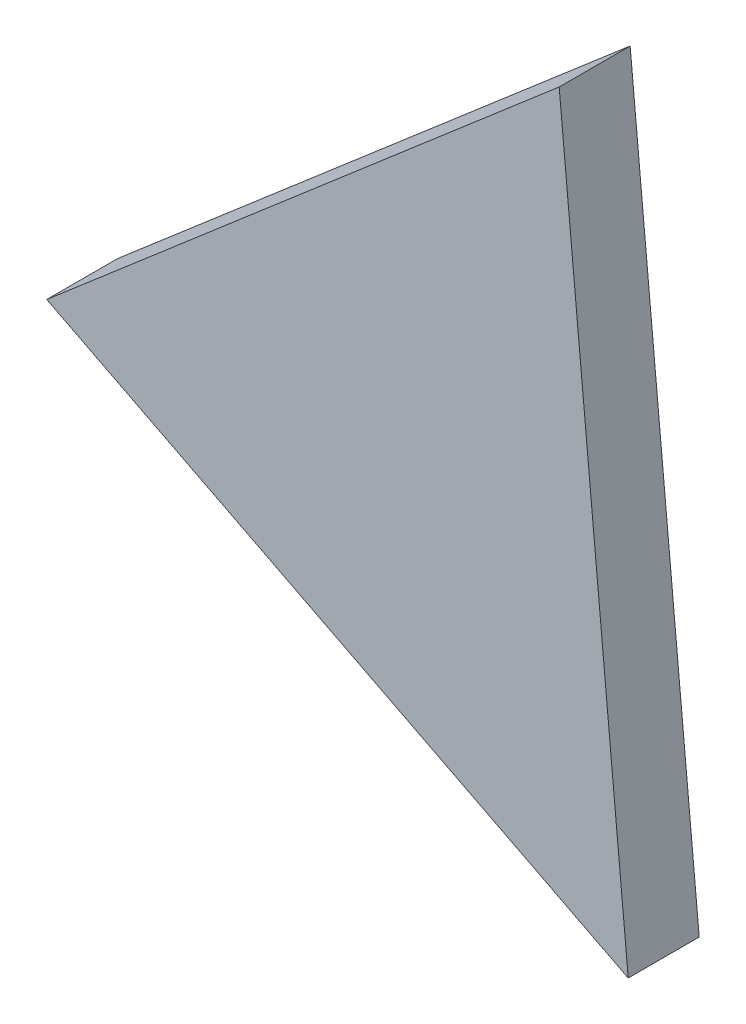
ISO-10303-21;
HEADER;
FILE_DESCRIPTION(('STEP AP214'),'2;1');
FILE_NAME('part.step','',(''),(''),'','','');
FILE_SCHEMA(('AUTOMOTIVE_DESIGN { 1 0 10303 214 1 1 1 1 }'));
ENDSEC;
DATA;
#1=APPLICATION_CONTEXT('core data for automotive mechanical design processes');
#2=APPLICATION_PROTOCOL_DEFINITION('international standard','automotive_design',2000,#1);
#3=PRODUCT_CONTEXT('',#1,'mechanical');
#4=PRODUCT('Part','Part','',(#3));
#5=PRODUCT_RELATED_PRODUCT_CATEGORY('part','',(#4));
#6=PRODUCT_DEFINITION_FORMATION('','',#4);
#7=PRODUCT_DEFINITION_CONTEXT('part definition',#1,'design');
#8=PRODUCT_DEFINITION('design','',#6,#7);
#9=PRODUCT_DEFINITION_SHAPE('','',#8);
#10=(LENGTH_UNIT() NAMED_UNIT(*) SI_UNIT(.MILLI.,.METRE.));
#11=(NAMED_UNIT(*) PLANE_ANGLE_UNIT() SI_UNIT($,.RADIAN.));
#12=(NAMED_UNIT(*) SI_UNIT($,.STERADIAN.) SOLID_ANGLE_UNIT());
#13=UNCERTAINTY_MEASURE_WITH_UNIT(LENGTH_MEASURE(1.E-05),#10,'distance_accuracy_value','');
#14=(GEOMETRIC_REPRESENTATION_CONTEXT(3) GLOBAL_UNCERTAINTY_ASSIGNED_CONTEXT((#13)) GLOBAL_UNIT_ASSIGNED_CONTEXT((#10,
#11,#12)) REPRESENTATION_CONTEXT('',''));
#15=CARTESIAN_POINT('',(0.,0.,0.));
#16=DIRECTION('',(0.,0.,1.));
#17=DIRECTION('',(1.,0.,0.));
#18=AXIS2_PLACEMENT_3D('',#15,#16,#17);
#19=CARTESIAN_POINT('',(-167.303978223959,-24.2995751352526,-30.));
#20=DIRECTION('',(-0.454765036187736,-0.890611453924306,0.));
#21=DIRECTION('',(0.890611453924307,-0.454765036187736,0.));
#22=AXIS2_PLACEMENT_3D('',#19,#20,#21);
#23=PLANE('',#22);
#24=DIRECTION('',(0.890611453924306,-0.454765036187736,0.));
#25=VECTOR('',#24,1.);
#26=CARTESIAN_POINT('',(-167.303978223959,-24.2995751352526,0.));
#27=LINE('',#26,#25);
#28=CARTESIAN_POINT('',(-167.303978223959,-24.2995751352526,0.));
#29=VERTEX_POINT('',#28);
#30=CARTESIAN_POINT('',(78.4197156428583,-149.771287901957,0.));
#31=VERTEX_POINT('',#30);
#32=EDGE_CURVE('E91',#29,#31,#27,.T.);
#33=ORIENTED_EDGE('',*,*,#32,.F.);
#34=DIRECTION('',(0.,0.,1.));
#35=VECTOR('',#34,1.);
#36=CARTESIAN_POINT('',(-167.303978223959,-24.2995751352526,-30.));
#37=LINE('',#36,#35);
#38=CARTESIAN_POINT('',(-167.303978223959,-24.2995751352526,-30.));
#39=VERTEX_POINT('',#38);
#40=EDGE_CURVE('E11',#39,#29,#37,.T.);
#41=ORIENTED_EDGE('',*,*,#40,.F.);
#42=DIRECTION('',(0.890611453924306,-0.454765036187736,0.));
#43=VECTOR('',#42,1.);
#44=CARTESIAN_POINT('',(-167.303978223959,-24.2995751352526,-30.));
#45=LINE('',#44,#43);
#46=CARTESIAN_POINT('',(78.4197156428583,-149.771287901957,-30.));
#47=VERTEX_POINT('',#46);
#48=EDGE_CURVE('E83',#39,#47,#45,.T.);
#49=ORIENTED_EDGE('',*,*,#48,.T.);
#50=DIRECTION('',(0.,0.,1.));
#51=VECTOR('',#50,1.);
#52=CARTESIAN_POINT('',(78.4197156428583,-149.771287901957,-30.));
#53=LINE('',#52,#51);
#54=EDGE_CURVE('E42',#47,#31,#53,.T.);
#55=ORIENTED_EDGE('',*,*,#54,.T.);
#56=EDGE_LOOP('',(#33,#41,#49,#55));
#57=FACE_BOUND('',#56,.T.);
#58=ADVANCED_FACE('F39',(#57),#23,.T.);
#59=CARTESIAN_POINT('',(49.2294634045813,161.732960197442,-30.));
#60=DIRECTION('',(-0.651664196820821,0.758507596917707,0.));
#61=DIRECTION('',(-0.758507596917707,-0.651664196820821,0.));
#62=AXIS2_PLACEMENT_3D('',#59,#60,#61);
#63=PLANE('',#62);
#64=DIRECTION('',(-0.758507596917707,-0.651664196820821,0.));
#65=VECTOR('',#64,1.);
#66=CARTESIAN_POINT('',(49.2294634045813,161.732960197442,0.));
#67=LINE('',#66,#65);
#68=CARTESIAN_POINT('',(49.2294634045813,161.732960197442,0.));
#69=VERTEX_POINT('',#68);
#70=EDGE_CURVE('E85',#69,#29,#67,.T.);
#71=ORIENTED_EDGE('',*,*,#70,.F.);
#72=DIRECTION('',(0.,0.,1.));
#73=VECTOR('',#72,1.);
#74=CARTESIAN_POINT('',(49.2294634045813,161.732960197442,-30.));
#75=LINE('',#74,#73);
#76=CARTESIAN_POINT('',(49.2294634045813,161.732960197442,-30.));
#77=VERTEX_POINT('',#76);
#78=EDGE_CURVE('E48',#77,#69,#75,.T.);
#79=ORIENTED_EDGE('',*,*,#78,.F.);
#80=DIRECTION('',(-0.758507596917707,-0.651664196820821,0.));
#81=VECTOR('',#80,1.);
#82=CARTESIAN_POINT('',(49.2294634045813,161.732960197442,-30.));
#83=LINE('',#82,#81);
#84=EDGE_CURVE('E80',#77,#39,#83,.T.);
#85=ORIENTED_EDGE('',*,*,#84,.T.);
#86=ORIENTED_EDGE('',*,*,#40,.T.);
#87=EDGE_LOOP('',(#71,#79,#85,#86));
#88=FACE_BOUND('',#87,.T.);
#89=ADVANCED_FACE('F95',(#88),#63,.T.);
#90=CARTESIAN_POINT('',(78.4197156428583,-149.771287901957,-30.));
#91=DIRECTION('',(0.995638167136849,0.0932986609784746,0.));
#92=DIRECTION('',(-0.0932986609784747,0.995638167136849,0.));
#93=AXIS2_PLACEMENT_3D('',#90,#91,#92);
#94=PLANE('',#93);
#95=DIRECTION('',(-0.0932986609784746,0.995638167136849,0.));
#96=VECTOR('',#95,1.);
#97=CARTESIAN_POINT('',(78.4197156428583,-149.771287901957,0.));
#98=LINE('',#97,#96);
#99=EDGE_CURVE('E78',#31,#69,#98,.T.);
#100=ORIENTED_EDGE('',*,*,#99,.F.);
#101=ORIENTED_EDGE('',*,*,#54,.F.);
#102=DIRECTION('',(-0.0932986609784746,0.995638167136849,0.));
#103=VECTOR('',#102,1.);
#104=CARTESIAN_POINT('',(78.4197156428583,-149.771287901957,-30.));
#105=LINE('',#104,#103);
#106=EDGE_CURVE('E76',#47,#77,#105,.T.);
#107=ORIENTED_EDGE('',*,*,#106,.T.);
#108=ORIENTED_EDGE('',*,*,#78,.T.);
#109=EDGE_LOOP('',(#100,#101,#107,#108));
#110=FACE_BOUND('',#109,.T.);
#111=ADVANCED_FACE('F75',(#110),#94,.T.);
#112=CARTESIAN_POINT('',(0.,0.,-30.));
#113=DIRECTION('',(0.,0.,-1.));
#114=DIRECTION('',(-1.,0.,0.));
#115=AXIS2_PLACEMENT_3D('',#112,#113,#114);
#116=PLANE('',#115);
#117=ORIENTED_EDGE('',*,*,#48,.F.);
#118=ORIENTED_EDGE('',*,*,#84,.F.);
#119=ORIENTED_EDGE('',*,*,#106,.F.);
#120=EDGE_LOOP('',(#117,#118,#119));
#121=FACE_BOUND('',#120,.T.);
#122=ADVANCED_FACE('F82',(#121),#116,.T.);
#123=CARTESIAN_POINT('',(0.,0.,0.));
#124=DIRECTION('',(0.,0.,-1.));
#125=DIRECTION('',(-1.,0.,0.));
#126=AXIS2_PLACEMENT_3D('',#123,#124,#125);
#127=PLANE('',#126);
#128=ORIENTED_EDGE('',*,*,#32,.T.);
#129=ORIENTED_EDGE('',*,*,#99,.T.);
#130=ORIENTED_EDGE('',*,*,#70,.T.);
#131=EDGE_LOOP('',(#128,#129,#130));
#132=FACE_BOUND('',#131,.T.);
#133=ADVANCED_FACE('F94',(#132),#127,.F.);
#134=CLOSED_SHELL('',(#58,#89,#111,#122,#133));
#135=MANIFOLD_SOLID_BREP('B2',#134);
#136=ADVANCED_BREP_SHAPE_REPRESENTATION('',(#18,#135),#14);
#137=SHAPE_DEFINITION_REPRESENTATION(#9,#136);
ENDSEC;
END-ISO-10303-21;
